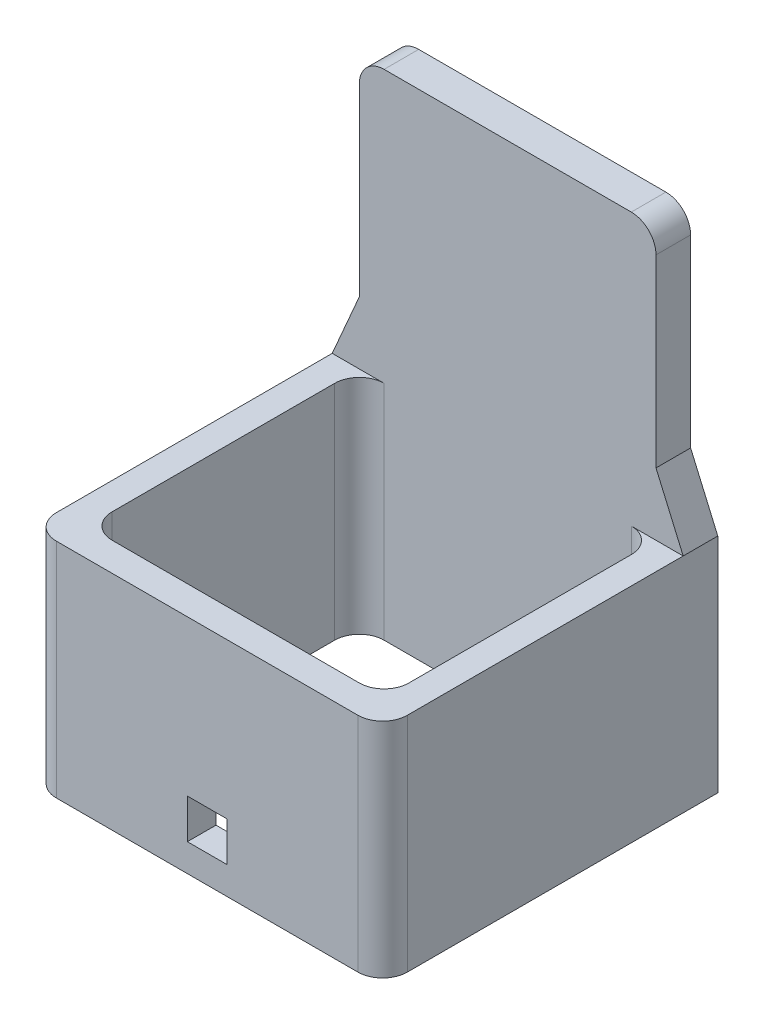
ISO-10303-21;
HEADER;
FILE_DESCRIPTION(('STEP AP214'),'2;1');
FILE_NAME('part.step','',(''),(''),'','','');
FILE_SCHEMA(('AUTOMOTIVE_DESIGN { 1 0 10303 214 1 1 1 1 }'));
ENDSEC;
DATA;
#1=APPLICATION_CONTEXT('core data for automotive mechanical design processes');
#2=APPLICATION_PROTOCOL_DEFINITION('international standard','automotive_design',2000,#1);
#3=PRODUCT_CONTEXT('',#1,'mechanical');
#4=PRODUCT('Part','Part','',(#3));
#5=PRODUCT_RELATED_PRODUCT_CATEGORY('part','',(#4));
#6=PRODUCT_DEFINITION_FORMATION('','',#4);
#7=PRODUCT_DEFINITION_CONTEXT('part definition',#1,'design');
#8=PRODUCT_DEFINITION('design','',#6,#7);
#9=PRODUCT_DEFINITION_SHAPE('','',#8);
#10=(LENGTH_UNIT() NAMED_UNIT(*) SI_UNIT(.MILLI.,.METRE.));
#11=(NAMED_UNIT(*) PLANE_ANGLE_UNIT() SI_UNIT($,.RADIAN.));
#12=(NAMED_UNIT(*) SI_UNIT($,.STERADIAN.) SOLID_ANGLE_UNIT());
#13=UNCERTAINTY_MEASURE_WITH_UNIT(LENGTH_MEASURE(1.E-05),#10,'distance_accuracy_value','');
#14=(GEOMETRIC_REPRESENTATION_CONTEXT(3) GLOBAL_UNCERTAINTY_ASSIGNED_CONTEXT((#13)) GLOBAL_UNIT_ASSIGNED_CONTEXT((#10,
#11,#12)) REPRESENTATION_CONTEXT('',''));
#15=CARTESIAN_POINT('',(0.,0.,0.));
#16=DIRECTION('',(0.,0.,1.));
#17=DIRECTION('',(1.,0.,0.));
#18=AXIS2_PLACEMENT_3D('',#15,#16,#17);
#19=CARTESIAN_POINT('',(5.,-5.,7.));
#20=DIRECTION('',(0.,0.,-1.));
#21=DIRECTION('',(-1.,0.,0.));
#22=AXIS2_PLACEMENT_3D('',#19,#20,#21);
#23=CYLINDRICAL_SURFACE('',#22,5.);
#24=CARTESIAN_POINT('',(5.,-5.,7.));
#25=DIRECTION('',(0.,0.,1.));
#26=DIRECTION('',(-1.,0.,0.));
#27=AXIS2_PLACEMENT_3D('',#24,#25,#26);
#28=CIRCLE('',#27,5.);
#29=CARTESIAN_POINT('',(5.,0.,7.));
#30=VERTEX_POINT('',#29);
#31=CARTESIAN_POINT('',(0.,-5.,7.));
#32=VERTEX_POINT('',#31);
#33=EDGE_CURVE('E340',#30,#32,#28,.T.);
#34=ORIENTED_EDGE('',*,*,#33,.F.);
#35=DIRECTION('',(0.,0.,1.));
#36=VECTOR('',#35,1.);
#37=CARTESIAN_POINT('',(5.,0.,7.));
#38=LINE('',#37,#36);
#39=CARTESIAN_POINT('',(5.,0.,0.));
#40=VERTEX_POINT('',#39);
#41=EDGE_CURVE('E341',#40,#30,#38,.T.);
#42=ORIENTED_EDGE('',*,*,#41,.F.);
#43=CARTESIAN_POINT('',(5.,-5.,0.));
#44=DIRECTION('',(0.,0.,-1.));
#45=DIRECTION('',(-1.,0.,0.));
#46=AXIS2_PLACEMENT_3D('',#43,#44,#45);
#47=CIRCLE('',#46,5.);
#48=CARTESIAN_POINT('',(0.,-5.,0.));
#49=VERTEX_POINT('',#48);
#50=EDGE_CURVE('E324',#49,#40,#47,.T.);
#51=ORIENTED_EDGE('',*,*,#50,.F.);
#52=DIRECTION('',(0.,0.,-1.));
#53=VECTOR('',#52,1.);
#54=CARTESIAN_POINT('',(0.,-5.,7.));
#55=LINE('',#54,#53);
#56=EDGE_CURVE('E440',#32,#49,#55,.T.);
#57=ORIENTED_EDGE('',*,*,#56,.F.);
#58=EDGE_LOOP('',(#34,#42,#51,#57));
#59=FACE_BOUND('',#58,.T.);
#60=ADVANCED_FACE('F15',(#59),#23,.T.);
#61=CARTESIAN_POINT('',(55.,-5.,7.));
#62=DIRECTION('',(0.,0.,-1.));
#63=DIRECTION('',(-1.,0.,0.));
#64=AXIS2_PLACEMENT_3D('',#61,#62,#63);
#65=CYLINDRICAL_SURFACE('',#64,5.);
#66=CARTESIAN_POINT('',(55.,-5.,7.));
#67=DIRECTION('',(0.,0.,1.));
#68=DIRECTION('',(-1.,0.,0.));
#69=AXIS2_PLACEMENT_3D('',#66,#67,#68);
#70=CIRCLE('',#69,5.);
#71=CARTESIAN_POINT('',(60.,-5.,7.));
#72=VERTEX_POINT('',#71);
#73=CARTESIAN_POINT('',(55.,0.,7.));
#74=VERTEX_POINT('',#73);
#75=EDGE_CURVE('E337',#72,#74,#70,.T.);
#76=ORIENTED_EDGE('',*,*,#75,.F.);
#77=DIRECTION('',(0.,0.,1.));
#78=VECTOR('',#77,1.);
#79=CARTESIAN_POINT('',(60.,-5.,7.));
#80=LINE('',#79,#78);
#81=CARTESIAN_POINT('',(60.,-5.,0.));
#82=VERTEX_POINT('',#81);
#83=EDGE_CURVE('E372',#82,#72,#80,.T.);
#84=ORIENTED_EDGE('',*,*,#83,.F.);
#85=CARTESIAN_POINT('',(55.,-5.,0.));
#86=DIRECTION('',(0.,0.,-1.));
#87=DIRECTION('',(-1.,0.,0.));
#88=AXIS2_PLACEMENT_3D('',#85,#86,#87);
#89=CIRCLE('',#88,5.);
#90=CARTESIAN_POINT('',(55.,0.,0.));
#91=VERTEX_POINT('',#90);
#92=EDGE_CURVE('E350',#91,#82,#89,.T.);
#93=ORIENTED_EDGE('',*,*,#92,.F.);
#94=DIRECTION('',(0.,0.,-1.));
#95=VECTOR('',#94,1.);
#96=CARTESIAN_POINT('',(55.,0.,7.));
#97=LINE('',#96,#95);
#98=EDGE_CURVE('E391',#74,#91,#97,.T.);
#99=ORIENTED_EDGE('',*,*,#98,.F.);
#100=EDGE_LOOP('',(#76,#84,#93,#99));
#101=FACE_BOUND('',#100,.T.);
#102=ADVANCED_FACE('F682',(#101),#65,.T.);
#103=CARTESIAN_POINT('',(60.4957416500345,0.,62.792968406215));
#104=DIRECTION('',(0.,-1.,0.));
#105=DIRECTION('',(0.,0.,-1.));
#106=AXIS2_PLACEMENT_3D('',#103,#104,#105);
#107=CYLINDRICAL_SURFACE('',#106,5.);
#108=CARTESIAN_POINT('',(60.4957416500345,-100.,62.792968406215));
#109=DIRECTION('',(0.,-1.,0.));
#110=DIRECTION('',(0.,0.,1.));
#111=AXIS2_PLACEMENT_3D('',#108,#109,#110);
#112=CIRCLE('',#111,5.);
#113=CARTESIAN_POINT('',(65.4957416500345,-100.,62.792968406215));
#114=VERTEX_POINT('',#113);
#115=CARTESIAN_POINT('',(60.4957416500345,-100.,67.792968406215));
#116=VERTEX_POINT('',#115);
#117=EDGE_CURVE('E241',#114,#116,#112,.T.);
#118=ORIENTED_EDGE('',*,*,#117,.F.);
#119=DIRECTION('',(0.,-1.,0.));
#120=VECTOR('',#119,1.);
#121=CARTESIAN_POINT('',(65.4957416500345,-100.,62.792968406215));
#122=LINE('',#121,#120);
#123=CARTESIAN_POINT('',(65.4957416500345,-55.,62.792968406215));
#124=VERTEX_POINT('',#123);
#125=EDGE_CURVE('E234',#124,#114,#122,.T.);
#126=ORIENTED_EDGE('',*,*,#125,.F.);
#127=CARTESIAN_POINT('',(60.4957416500345,-55.,62.792968406215));
#128=DIRECTION('',(0.,1.,0.));
#129=DIRECTION('',(0.,0.,1.));
#130=AXIS2_PLACEMENT_3D('',#127,#128,#129);
#131=CIRCLE('',#130,5.);
#132=CARTESIAN_POINT('',(60.4957416500345,-55.,67.792968406215));
#133=VERTEX_POINT('',#132);
#134=EDGE_CURVE('E238',#133,#124,#131,.T.);
#135=ORIENTED_EDGE('',*,*,#134,.F.);
#136=DIRECTION('',(0.,1.,0.));
#137=VECTOR('',#136,1.);
#138=CARTESIAN_POINT('',(60.4957416500345,-55.,67.792968406215));
#139=LINE('',#138,#137);
#140=EDGE_CURVE('E363',#116,#133,#139,.T.);
#141=ORIENTED_EDGE('',*,*,#140,.F.);
#142=EDGE_LOOP('',(#118,#126,#135,#141));
#143=FACE_BOUND('',#142,.T.);
#144=ADVANCED_FACE('F236',(#143),#107,.T.);
#145=CARTESIAN_POINT('',(-0.495741650034525,0.,62.792968406215));
#146=DIRECTION('',(0.,1.,0.));
#147=DIRECTION('',(0.,0.,1.));
#148=AXIS2_PLACEMENT_3D('',#145,#146,#147);
#149=CYLINDRICAL_SURFACE('',#148,5.);
#150=CARTESIAN_POINT('',(-0.495741650034525,-55.,62.792968406215));
#151=DIRECTION('',(0.,1.,0.));
#152=DIRECTION('',(0.,0.,1.));
#153=AXIS2_PLACEMENT_3D('',#150,#151,#152);
#154=CIRCLE('',#153,5.);
#155=CARTESIAN_POINT('',(-5.49574165003453,-55.,62.792968406215));
#156=VERTEX_POINT('',#155);
#157=CARTESIAN_POINT('',(-0.495741650034527,-55.,67.792968406215));
#158=VERTEX_POINT('',#157);
#159=EDGE_CURVE('E270',#156,#158,#154,.T.);
#160=ORIENTED_EDGE('',*,*,#159,.F.);
#161=DIRECTION('',(0.,1.,0.));
#162=VECTOR('',#161,1.);
#163=CARTESIAN_POINT('',(-5.49574165003453,-55.,62.792968406215));
#164=LINE('',#163,#162);
#165=CARTESIAN_POINT('',(-5.49574165003453,-100.,62.792968406215));
#166=VERTEX_POINT('',#165);
#167=EDGE_CURVE('E285',#166,#156,#164,.T.);
#168=ORIENTED_EDGE('',*,*,#167,.F.);
#169=CARTESIAN_POINT('',(-0.495741650034525,-100.,62.792968406215));
#170=DIRECTION('',(0.,-1.,0.));
#171=DIRECTION('',(0.,0.,1.));
#172=AXIS2_PLACEMENT_3D('',#169,#170,#171);
#173=CIRCLE('',#172,5.);
#174=CARTESIAN_POINT('',(-0.49574165003452,-100.,67.792968406215));
#175=VERTEX_POINT('',#174);
#176=EDGE_CURVE('E419',#175,#166,#173,.T.);
#177=ORIENTED_EDGE('',*,*,#176,.F.);
#178=DIRECTION('',(0.,-1.,0.));
#179=VECTOR('',#178,1.);
#180=CARTESIAN_POINT('',(-0.495741650034525,-100.,67.792968406215));
#181=LINE('',#180,#179);
#182=EDGE_CURVE('E366',#158,#175,#181,.T.);
#183=ORIENTED_EDGE('',*,*,#182,.F.);
#184=EDGE_LOOP('',(#160,#168,#177,#183));
#185=FACE_BOUND('',#184,.T.);
#186=ADVANCED_FACE('F782',(#185),#149,.T.);
#187=CARTESIAN_POINT('',(26.,-86.3993665561437,49.792968406215));
#188=DIRECTION('',(0.,1.,0.));
#189=DIRECTION('',(1.,0.,0.));
#190=AXIS2_PLACEMENT_3D('',#187,#188,#189);
#191=PLANE('',#190);
#192=DIRECTION('',(1.,0.,0.));
#193=VECTOR('',#192,1.);
#194=CARTESIAN_POINT('',(60.,-86.3993665561437,62.));
#195=LINE('',#194,#193);
#196=CARTESIAN_POINT('',(26.,-86.3993665561437,62.));
#197=VERTEX_POINT('',#196);
#198=CARTESIAN_POINT('',(34.,-86.3993665561437,62.));
#199=VERTEX_POINT('',#198);
#200=EDGE_CURVE('E356',#197,#199,#195,.T.);
#201=ORIENTED_EDGE('',*,*,#200,.T.);
#202=DIRECTION('',(0.,0.,1.));
#203=VECTOR('',#202,1.);
#204=CARTESIAN_POINT('',(34.,-86.3993665561437,49.792968406215));
#205=LINE('',#204,#203);
#206=CARTESIAN_POINT('',(34.,-86.3993665561437,67.792968406215));
#207=VERTEX_POINT('',#206);
#208=EDGE_CURVE('E312',#199,#207,#205,.T.);
#209=ORIENTED_EDGE('',*,*,#208,.T.);
#210=DIRECTION('',(-1.,0.,0.));
#211=VECTOR('',#210,1.);
#212=CARTESIAN_POINT('',(26.,-86.3993665561437,67.792968406215));
#213=LINE('',#212,#211);
#214=CARTESIAN_POINT('',(26.,-86.3993665561437,67.792968406215));
#215=VERTEX_POINT('',#214);
#216=EDGE_CURVE('E358',#207,#215,#213,.T.);
#217=ORIENTED_EDGE('',*,*,#216,.T.);
#218=DIRECTION('',(0.,0.,1.));
#219=VECTOR('',#218,1.);
#220=CARTESIAN_POINT('',(26.,-86.3993665561437,49.792968406215));
#221=LINE('',#220,#219);
#222=EDGE_CURVE('E10',#197,#215,#221,.T.);
#223=ORIENTED_EDGE('',*,*,#222,.F.);
#224=EDGE_LOOP('',(#201,#209,#217,#223));
#225=FACE_BOUND('',#224,.T.);
#226=ADVANCED_FACE('F787',(#225),#191,.F.);
#227=CARTESIAN_POINT('',(26.,-86.3993665561437,49.792968406215));
#228=DIRECTION('',(-1.,0.,0.));
#229=DIRECTION('',(0.,0.,1.));
#230=AXIS2_PLACEMENT_3D('',#227,#228,#229);
#231=PLANE('',#230);
#232=DIRECTION('',(0.,1.,0.));
#233=VECTOR('',#232,1.);
#234=CARTESIAN_POINT('',(26.,-55.,62.));
#235=LINE('',#234,#233);
#236=CARTESIAN_POINT('',(26.,-94.3993665561437,62.));
#237=VERTEX_POINT('',#236);
#238=EDGE_CURVE('E410',#237,#197,#235,.T.);
#239=ORIENTED_EDGE('',*,*,#238,.T.);
#240=ORIENTED_EDGE('',*,*,#222,.T.);
#241=DIRECTION('',(0.,-1.,0.));
#242=VECTOR('',#241,1.);
#243=CARTESIAN_POINT('',(26.,-86.3993665561437,67.792968406215));
#244=LINE('',#243,#242);
#245=CARTESIAN_POINT('',(26.,-94.3993665561437,67.792968406215));
#246=VERTEX_POINT('',#245);
#247=EDGE_CURVE('E247',#215,#246,#244,.T.);
#248=ORIENTED_EDGE('',*,*,#247,.T.);
#249=DIRECTION('',(0.,0.,1.));
#250=VECTOR('',#249,1.);
#251=CARTESIAN_POINT('',(26.,-94.3993665561437,49.792968406215));
#252=LINE('',#251,#250);
#253=EDGE_CURVE('E19',#237,#246,#252,.T.);
#254=ORIENTED_EDGE('',*,*,#253,.F.);
#255=EDGE_LOOP('',(#239,#240,#248,#254));
#256=FACE_BOUND('',#255,.T.);
#257=ADVANCED_FACE('F815',(#256),#231,.F.);
#258=CARTESIAN_POINT('',(26.,-94.3993665561437,49.792968406215));
#259=DIRECTION('',(0.,-1.,0.));
#260=DIRECTION('',(0.,0.,-1.));
#261=AXIS2_PLACEMENT_3D('',#258,#259,#260);
#262=PLANE('',#261);
#263=DIRECTION('',(-1.,0.,0.));
#264=VECTOR('',#263,1.);
#265=CARTESIAN_POINT('',(60.,-94.3993665561437,62.));
#266=LINE('',#265,#264);
#267=CARTESIAN_POINT('',(34.,-94.3993665561437,62.));
#268=VERTEX_POINT('',#267);
#269=EDGE_CURVE('E319',#268,#237,#266,.T.);
#270=ORIENTED_EDGE('',*,*,#269,.T.);
#271=ORIENTED_EDGE('',*,*,#253,.T.);
#272=DIRECTION('',(1.,0.,0.));
#273=VECTOR('',#272,1.);
#274=CARTESIAN_POINT('',(26.,-94.3993665561437,67.792968406215));
#275=LINE('',#274,#273);
#276=CARTESIAN_POINT('',(34.,-94.3993665561437,67.792968406215));
#277=VERTEX_POINT('',#276);
#278=EDGE_CURVE('E346',#246,#277,#275,.T.);
#279=ORIENTED_EDGE('',*,*,#278,.T.);
#280=DIRECTION('',(0.,0.,1.));
#281=VECTOR('',#280,1.);
#282=CARTESIAN_POINT('',(34.,-94.3993665561437,49.792968406215));
#283=LINE('',#282,#281);
#284=EDGE_CURVE('E284',#268,#277,#283,.T.);
#285=ORIENTED_EDGE('',*,*,#284,.F.);
#286=EDGE_LOOP('',(#270,#271,#279,#285));
#287=FACE_BOUND('',#286,.T.);
#288=ADVANCED_FACE('F668',(#287),#262,.F.);
#289=CARTESIAN_POINT('',(34.,-86.3993665561437,49.792968406215));
#290=DIRECTION('',(1.,0.,0.));
#291=DIRECTION('',(0.,1.,0.));
#292=AXIS2_PLACEMENT_3D('',#289,#290,#291);
#293=PLANE('',#292);
#294=DIRECTION('',(0.,-1.,0.));
#295=VECTOR('',#294,1.);
#296=CARTESIAN_POINT('',(34.,-55.,62.));
#297=LINE('',#296,#295);
#298=EDGE_CURVE('E352',#199,#268,#297,.T.);
#299=ORIENTED_EDGE('',*,*,#298,.T.);
#300=ORIENTED_EDGE('',*,*,#284,.T.);
#301=DIRECTION('',(0.,1.,0.));
#302=VECTOR('',#301,1.);
#303=CARTESIAN_POINT('',(34.,-86.3993665561437,67.792968406215));
#304=LINE('',#303,#302);
#305=EDGE_CURVE('E362',#277,#207,#304,.T.);
#306=ORIENTED_EDGE('',*,*,#305,.T.);
#307=ORIENTED_EDGE('',*,*,#208,.F.);
#308=EDGE_LOOP('',(#299,#300,#306,#307));
#309=FACE_BOUND('',#308,.T.);
#310=ADVANCED_FACE('F662',(#309),#293,.F.);
#311=CARTESIAN_POINT('',(-5.49574165003453,-55.,0.));
#312=DIRECTION('',(-0.91750472386796,0.397724881896994,0.));
#313=DIRECTION('',(0.,0.,1.));
#314=AXIS2_PLACEMENT_3D('',#311,#312,#313);
#315=PLANE('',#314);
#316=DIRECTION('',(-0.397724881896994,-0.91750472386796,0.));
#317=VECTOR('',#316,1.);
#318=CARTESIAN_POINT('',(-5.49574165003453,-55.,7.));
#319=LINE('',#318,#317);
#320=CARTESIAN_POINT('',(0.,-42.3219676349782,7.));
#321=VERTEX_POINT('',#320);
#322=CARTESIAN_POINT('',(-5.49574165003453,-55.,7.));
#323=VERTEX_POINT('',#322);
#324=EDGE_CURVE('E443',#321,#323,#319,.T.);
#325=ORIENTED_EDGE('',*,*,#324,.F.);
#326=DIRECTION('',(0.,0.,1.));
#327=VECTOR('',#326,1.);
#328=CARTESIAN_POINT('',(0.,-42.3219676349782,0.));
#329=LINE('',#328,#327);
#330=CARTESIAN_POINT('',(0.,-42.3219676349782,0.));
#331=VERTEX_POINT('',#330);
#332=EDGE_CURVE('E514',#331,#321,#329,.T.);
#333=ORIENTED_EDGE('',*,*,#332,.F.);
#334=DIRECTION('',(-0.397724881896994,-0.91750472386796,0.));
#335=VECTOR('',#334,1.);
#336=CARTESIAN_POINT('',(-5.49574165003453,-55.,0.));
#337=LINE('',#336,#335);
#338=CARTESIAN_POINT('',(-5.49574165003453,-55.,0.));
#339=VERTEX_POINT('',#338);
#340=EDGE_CURVE('E279',#331,#339,#337,.T.);
#341=ORIENTED_EDGE('',*,*,#340,.T.);
#342=DIRECTION('',(0.,0.,1.));
#343=VECTOR('',#342,1.);
#344=CARTESIAN_POINT('',(-5.49574165003453,-55.,-45.3343487466615));
#345=LINE('',#344,#343);
#346=EDGE_CURVE('E281',#339,#323,#345,.T.);
#347=ORIENTED_EDGE('',*,*,#346,.T.);
#348=EDGE_LOOP('',(#325,#333,#341,#347));
#349=FACE_BOUND('',#348,.T.);
#350=ADVANCED_FACE('F667',(#349),#315,.T.);
#351=CARTESIAN_POINT('',(65.4957416500345,-55.,0.));
#352=DIRECTION('',(0.91750472386796,0.397724881896994,0.));
#353=DIRECTION('',(0.,0.,-1.));
#354=AXIS2_PLACEMENT_3D('',#351,#352,#353);
#355=PLANE('',#354);
#356=DIRECTION('',(-0.397724881896994,0.91750472386796,0.));
#357=VECTOR('',#356,1.);
#358=CARTESIAN_POINT('',(65.4957416500345,-55.,7.));
#359=LINE('',#358,#357);
#360=CARTESIAN_POINT('',(65.4957416500345,-55.,7.));
#361=VERTEX_POINT('',#360);
#362=CARTESIAN_POINT('',(60.,-42.3219676349782,7.));
#363=VERTEX_POINT('',#362);
#364=EDGE_CURVE('E347',#361,#363,#359,.T.);
#365=ORIENTED_EDGE('',*,*,#364,.F.);
#366=DIRECTION('',(0.,0.,1.));
#367=VECTOR('',#366,1.);
#368=CARTESIAN_POINT('',(65.4957416500345,-55.,-45.3343487466615));
#369=LINE('',#368,#367);
#370=CARTESIAN_POINT('',(65.4957416500345,-55.,0.));
#371=VERTEX_POINT('',#370);
#372=EDGE_CURVE('E246',#371,#361,#369,.T.);
#373=ORIENTED_EDGE('',*,*,#372,.F.);
#374=DIRECTION('',(-0.397724881896994,0.91750472386796,0.));
#375=VECTOR('',#374,1.);
#376=CARTESIAN_POINT('',(65.4957416500345,-55.,0.));
#377=LINE('',#376,#375);
#378=CARTESIAN_POINT('',(60.,-42.3219676349782,0.));
#379=VERTEX_POINT('',#378);
#380=EDGE_CURVE('E403',#371,#379,#377,.T.);
#381=ORIENTED_EDGE('',*,*,#380,.T.);
#382=DIRECTION('',(0.,0.,1.));
#383=VECTOR('',#382,1.);
#384=CARTESIAN_POINT('',(60.,-42.3219676349782,0.));
#385=LINE('',#384,#383);
#386=EDGE_CURVE('E386',#379,#363,#385,.T.);
#387=ORIENTED_EDGE('',*,*,#386,.T.);
#388=EDGE_LOOP('',(#365,#373,#381,#387));
#389=FACE_BOUND('',#388,.T.);
#390=ADVANCED_FACE('F552',(#389),#355,.T.);
#391=CARTESIAN_POINT('',(5.,-100.,57.));
#392=DIRECTION('',(0.,1.,0.));
#393=DIRECTION('',(0.,0.,1.));
#394=AXIS2_PLACEMENT_3D('',#391,#392,#393);
#395=CYLINDRICAL_SURFACE('',#394,5.);
#396=CARTESIAN_POINT('',(5.,-55.,57.));
#397=DIRECTION('',(0.,-1.,0.));
#398=DIRECTION('',(0.,0.,1.));
#399=AXIS2_PLACEMENT_3D('',#396,#397,#398);
#400=CIRCLE('',#399,5.);
#401=CARTESIAN_POINT('',(5.,-55.,62.));
#402=VERTEX_POINT('',#401);
#403=CARTESIAN_POINT('',(0.,-55.,57.));
#404=VERTEX_POINT('',#403);
#405=EDGE_CURVE('E290',#402,#404,#400,.T.);
#406=ORIENTED_EDGE('',*,*,#405,.F.);
#407=DIRECTION('',(0.,1.,0.));
#408=VECTOR('',#407,1.);
#409=CARTESIAN_POINT('',(5.,-55.,62.));
#410=LINE('',#409,#408);
#411=CARTESIAN_POINT('',(5.,-100.,62.));
#412=VERTEX_POINT('',#411);
#413=EDGE_CURVE('E371',#412,#402,#410,.T.);
#414=ORIENTED_EDGE('',*,*,#413,.F.);
#415=CARTESIAN_POINT('',(5.,-100.,57.));
#416=DIRECTION('',(0.,1.,0.));
#417=DIRECTION('',(0.,0.,1.));
#418=AXIS2_PLACEMENT_3D('',#415,#416,#417);
#419=CIRCLE('',#418,5.);
#420=CARTESIAN_POINT('',(0.,-100.,57.));
#421=VERTEX_POINT('',#420);
#422=EDGE_CURVE('E424',#421,#412,#419,.T.);
#423=ORIENTED_EDGE('',*,*,#422,.F.);
#424=DIRECTION('',(0.,-1.,0.));
#425=VECTOR('',#424,1.);
#426=CARTESIAN_POINT('',(0.,-100.,57.));
#427=LINE('',#426,#425);
#428=EDGE_CURVE('E306',#404,#421,#427,.T.);
#429=ORIENTED_EDGE('',*,*,#428,.F.);
#430=EDGE_LOOP('',(#406,#414,#423,#429));
#431=FACE_BOUND('',#430,.T.);
#432=ADVANCED_FACE('F706',(#431),#395,.F.);
#433=CARTESIAN_POINT('',(5.,0.,12.));
#434=DIRECTION('',(0.,-1.,0.));
#435=DIRECTION('',(0.,0.,-1.));
#436=AXIS2_PLACEMENT_3D('',#433,#434,#435);
#437=CYLINDRICAL_SURFACE('',#436,5.);
#438=CARTESIAN_POINT('',(5.,-55.,12.));
#439=DIRECTION('',(0.,-1.,0.));
#440=DIRECTION('',(0.,0.,1.));
#441=AXIS2_PLACEMENT_3D('',#438,#439,#440);
#442=CIRCLE('',#441,5.);
#443=CARTESIAN_POINT('',(0.,-55.,12.));
#444=VERTEX_POINT('',#443);
#445=CARTESIAN_POINT('',(5.,-55.,7.));
#446=VERTEX_POINT('',#445);
#447=EDGE_CURVE('E292',#444,#446,#442,.T.);
#448=ORIENTED_EDGE('',*,*,#447,.F.);
#449=DIRECTION('',(0.,1.,0.));
#450=VECTOR('',#449,1.);
#451=CARTESIAN_POINT('',(0.,-100.,12.));
#452=LINE('',#451,#450);
#453=CARTESIAN_POINT('',(0.,-100.,12.));
#454=VERTEX_POINT('',#453);
#455=EDGE_CURVE('E308',#454,#444,#452,.T.);
#456=ORIENTED_EDGE('',*,*,#455,.F.);
#457=CARTESIAN_POINT('',(5.,-100.,12.));
#458=DIRECTION('',(0.,1.,0.));
#459=DIRECTION('',(0.,0.,1.));
#460=AXIS2_PLACEMENT_3D('',#457,#458,#459);
#461=CIRCLE('',#460,5.);
#462=CARTESIAN_POINT('',(5.,-100.,7.));
#463=VERTEX_POINT('',#462);
#464=EDGE_CURVE('E332',#463,#454,#461,.T.);
#465=ORIENTED_EDGE('',*,*,#464,.F.);
#466=DIRECTION('',(0.,-1.,0.));
#467=VECTOR('',#466,1.);
#468=CARTESIAN_POINT('',(5.,0.,7.));
#469=LINE('',#468,#467);
#470=EDGE_CURVE('E444',#446,#463,#469,.T.);
#471=ORIENTED_EDGE('',*,*,#470,.F.);
#472=EDGE_LOOP('',(#448,#456,#465,#471));
#473=FACE_BOUND('',#472,.T.);
#474=ADVANCED_FACE('F740',(#473),#437,.F.);
#475=CARTESIAN_POINT('',(55.,0.,12.));
#476=DIRECTION('',(0.,1.,0.));
#477=DIRECTION('',(0.,0.,1.));
#478=AXIS2_PLACEMENT_3D('',#475,#476,#477);
#479=CYLINDRICAL_SURFACE('',#478,5.);
#480=CARTESIAN_POINT('',(55.,-100.,12.));
#481=DIRECTION('',(0.,1.,0.));
#482=DIRECTION('',(0.,0.,1.));
#483=AXIS2_PLACEMENT_3D('',#480,#481,#482);
#484=CIRCLE('',#483,5.);
#485=CARTESIAN_POINT('',(60.,-100.,12.));
#486=VERTEX_POINT('',#485);
#487=CARTESIAN_POINT('',(55.,-100.,7.));
#488=VERTEX_POINT('',#487);
#489=EDGE_CURVE('E400',#486,#488,#484,.T.);
#490=ORIENTED_EDGE('',*,*,#489,.F.);
#491=DIRECTION('',(0.,-1.,0.));
#492=VECTOR('',#491,1.);
#493=CARTESIAN_POINT('',(60.,-100.,12.));
#494=LINE('',#493,#492);
#495=CARTESIAN_POINT('',(60.,-55.,12.));
#496=VERTEX_POINT('',#495);
#497=EDGE_CURVE('E320',#496,#486,#494,.T.);
#498=ORIENTED_EDGE('',*,*,#497,.F.);
#499=CARTESIAN_POINT('',(55.,-55.,12.));
#500=DIRECTION('',(0.,-1.,0.));
#501=DIRECTION('',(0.,0.,1.));
#502=AXIS2_PLACEMENT_3D('',#499,#500,#501);
#503=CIRCLE('',#502,5.);
#504=CARTESIAN_POINT('',(55.,-55.,7.));
#505=VERTEX_POINT('',#504);
#506=EDGE_CURVE('E336',#505,#496,#503,.T.);
#507=ORIENTED_EDGE('',*,*,#506,.F.);
#508=DIRECTION('',(0.,1.,0.));
#509=VECTOR('',#508,1.);
#510=CARTESIAN_POINT('',(55.,0.,7.));
#511=LINE('',#510,#509);
#512=EDGE_CURVE('E351',#488,#505,#511,.T.);
#513=ORIENTED_EDGE('',*,*,#512,.F.);
#514=EDGE_LOOP('',(#490,#498,#507,#513));
#515=FACE_BOUND('',#514,.T.);
#516=ADVANCED_FACE('F482',(#515),#479,.F.);
#517=CARTESIAN_POINT('',(55.,-55.,57.));
#518=DIRECTION('',(0.,1.,0.));
#519=DIRECTION('',(0.,0.,1.));
#520=AXIS2_PLACEMENT_3D('',#517,#518,#519);
#521=CYLINDRICAL_SURFACE('',#520,5.);
#522=CARTESIAN_POINT('',(55.,-55.,57.));
#523=DIRECTION('',(0.,-1.,0.));
#524=DIRECTION('',(0.,0.,1.));
#525=AXIS2_PLACEMENT_3D('',#522,#523,#524);
#526=CIRCLE('',#525,5.);
#527=CARTESIAN_POINT('',(60.,-55.,57.));
#528=VERTEX_POINT('',#527);
#529=CARTESIAN_POINT('',(55.,-55.,62.));
#530=VERTEX_POINT('',#529);
#531=EDGE_CURVE('E291',#528,#530,#526,.T.);
#532=ORIENTED_EDGE('',*,*,#531,.F.);
#533=DIRECTION('',(0.,1.,0.));
#534=VECTOR('',#533,1.);
#535=CARTESIAN_POINT('',(60.,-55.,57.));
#536=LINE('',#535,#534);
#537=CARTESIAN_POINT('',(60.,-100.,57.));
#538=VERTEX_POINT('',#537);
#539=EDGE_CURVE('E323',#538,#528,#536,.T.);
#540=ORIENTED_EDGE('',*,*,#539,.F.);
#541=CARTESIAN_POINT('',(55.,-100.,57.));
#542=DIRECTION('',(0.,1.,0.));
#543=DIRECTION('',(0.,0.,1.));
#544=AXIS2_PLACEMENT_3D('',#541,#542,#543);
#545=CIRCLE('',#544,5.);
#546=CARTESIAN_POINT('',(55.,-100.,62.));
#547=VERTEX_POINT('',#546);
#548=EDGE_CURVE('E428',#547,#538,#545,.T.);
#549=ORIENTED_EDGE('',*,*,#548,.F.);
#550=DIRECTION('',(0.,-1.,0.));
#551=VECTOR('',#550,1.);
#552=CARTESIAN_POINT('',(55.,-100.,62.));
#553=LINE('',#552,#551);
#554=EDGE_CURVE('E357',#530,#547,#553,.T.);
#555=ORIENTED_EDGE('',*,*,#554,.F.);
#556=EDGE_LOOP('',(#532,#540,#549,#555));
#557=FACE_BOUND('',#556,.T.);
#558=ADVANCED_FACE('F492',(#557),#521,.F.);
#559=CARTESIAN_POINT('',(-5.49574165003453,-55.,-45.3343487466615));
#560=DIRECTION('',(-1.,0.,0.));
#561=DIRECTION('',(0.,0.,1.));
#562=AXIS2_PLACEMENT_3D('',#559,#560,#561);
#563=PLANE('',#562);
#564=DIRECTION('',(0.,0.,1.));
#565=VECTOR('',#564,1.);
#566=CARTESIAN_POINT('',(-5.49574165003453,-100.,-45.3343487466615));
#567=LINE('',#566,#565);
#568=CARTESIAN_POINT('',(-5.49574165003453,-100.,0.));
#569=VERTEX_POINT('',#568);
#570=EDGE_CURVE('E303',#569,#166,#567,.T.);
#571=ORIENTED_EDGE('',*,*,#570,.T.);
#572=ORIENTED_EDGE('',*,*,#167,.T.);
#573=DIRECTION('',(0.,0.,1.));
#574=VECTOR('',#573,1.);
#575=CARTESIAN_POINT('',(-5.49574165003453,-55.,-45.3343487466615));
#576=LINE('',#575,#574);
#577=EDGE_CURVE('E327',#323,#156,#576,.T.);
#578=ORIENTED_EDGE('',*,*,#577,.F.);
#579=ORIENTED_EDGE('',*,*,#346,.F.);
#580=DIRECTION('',(0.,-1.,0.));
#581=VECTOR('',#580,1.);
#582=CARTESIAN_POINT('',(-5.49574165003453,-55.,0.));
#583=LINE('',#582,#581);
#584=EDGE_CURVE('E276',#339,#569,#583,.T.);
#585=ORIENTED_EDGE('',*,*,#584,.T.);
#586=EDGE_LOOP('',(#571,#572,#578,#579,#585));
#587=FACE_BOUND('',#586,.T.);
#588=ADVANCED_FACE('F714',(#587),#563,.T.);
#589=CARTESIAN_POINT('',(0.,-100.,-45.3343487466615));
#590=DIRECTION('',(1.,0.,0.));
#591=DIRECTION('',(0.,1.,0.));
#592=AXIS2_PLACEMENT_3D('',#589,#590,#591);
#593=PLANE('',#592);
#594=DIRECTION('',(0.,0.,1.));
#595=VECTOR('',#594,1.);
#596=CARTESIAN_POINT('',(0.,-100.,-45.3343487466615));
#597=LINE('',#596,#595);
#598=EDGE_CURVE('E420',#454,#421,#597,.T.);
#599=ORIENTED_EDGE('',*,*,#598,.F.);
#600=ORIENTED_EDGE('',*,*,#455,.T.);
#601=DIRECTION('',(0.,0.,1.));
#602=VECTOR('',#601,1.);
#603=CARTESIAN_POINT('',(0.,-55.,-45.3343487466615));
#604=LINE('',#603,#602);
#605=EDGE_CURVE('E297',#444,#404,#604,.T.);
#606=ORIENTED_EDGE('',*,*,#605,.T.);
#607=ORIENTED_EDGE('',*,*,#428,.T.);
#608=EDGE_LOOP('',(#599,#600,#606,#607));
#609=FACE_BOUND('',#608,.T.);
#610=ADVANCED_FACE('F653',(#609),#593,.T.);
#611=CARTESIAN_POINT('',(60.,-55.,62.));
#612=DIRECTION('',(0.,0.,-1.));
#613=DIRECTION('',(0.,-1.,0.));
#614=AXIS2_PLACEMENT_3D('',#611,#612,#613);
#615=PLANE('',#614);
#616=ORIENTED_EDGE('',*,*,#298,.F.);
#617=ORIENTED_EDGE('',*,*,#200,.F.);
#618=ORIENTED_EDGE('',*,*,#238,.F.);
#619=ORIENTED_EDGE('',*,*,#269,.F.);
#620=EDGE_LOOP('',(#616,#617,#618,#619));
#621=FACE_BOUND('',#620,.T.);
#622=DIRECTION('',(1.,0.,0.));
#623=VECTOR('',#622,1.);
#624=CARTESIAN_POINT('',(60.,-100.,62.));
#625=LINE('',#624,#623);
#626=EDGE_CURVE('E433',#412,#547,#625,.T.);
#627=ORIENTED_EDGE('',*,*,#626,.F.);
#628=ORIENTED_EDGE('',*,*,#413,.T.);
#629=DIRECTION('',(1.,0.,0.));
#630=VECTOR('',#629,1.);
#631=CARTESIAN_POINT('',(60.,-55.,62.));
#632=LINE('',#631,#630);
#633=EDGE_CURVE('E286',#402,#530,#632,.T.);
#634=ORIENTED_EDGE('',*,*,#633,.T.);
#635=ORIENTED_EDGE('',*,*,#554,.T.);
#636=EDGE_LOOP('',(#627,#628,#634,#635));
#637=FACE_BOUND('',#636,.T.);
#638=ADVANCED_FACE('F496',(#621,#637),#615,.T.);
#639=CARTESIAN_POINT('',(65.4957416500345,-55.,-45.3343487466615));
#640=DIRECTION('',(1.,0.,0.));
#641=DIRECTION('',(0.,1.,0.));
#642=AXIS2_PLACEMENT_3D('',#639,#640,#641);
#643=PLANE('',#642);
#644=DIRECTION('',(0.,0.,1.));
#645=VECTOR('',#644,1.);
#646=CARTESIAN_POINT('',(65.4957416500345,-55.,-45.3343487466615));
#647=LINE('',#646,#645);
#648=EDGE_CURVE('E250',#361,#124,#647,.T.);
#649=ORIENTED_EDGE('',*,*,#648,.T.);
#650=ORIENTED_EDGE('',*,*,#125,.T.);
#651=DIRECTION('',(0.,0.,1.));
#652=VECTOR('',#651,1.);
#653=CARTESIAN_POINT('',(65.4957416500345,-100.,-45.3343487466615));
#654=LINE('',#653,#652);
#655=CARTESIAN_POINT('',(65.4957416500345,-100.,0.));
#656=VERTEX_POINT('',#655);
#657=EDGE_CURVE('E302',#656,#114,#654,.T.);
#658=ORIENTED_EDGE('',*,*,#657,.F.);
#659=DIRECTION('',(0.,1.,0.));
#660=VECTOR('',#659,1.);
#661=CARTESIAN_POINT('',(65.4957416500345,-55.,0.));
#662=LINE('',#661,#660);
#663=EDGE_CURVE('E280',#656,#371,#662,.T.);
#664=ORIENTED_EDGE('',*,*,#663,.T.);
#665=ORIENTED_EDGE('',*,*,#372,.T.);
#666=EDGE_LOOP('',(#649,#650,#658,#664,#665));
#667=FACE_BOUND('',#666,.T.);
#668=ADVANCED_FACE('F251',(#667),#643,.T.);
#669=CARTESIAN_POINT('',(0.,0.,67.792968406215));
#670=DIRECTION('',(0.,0.,-1.));
#671=DIRECTION('',(0.,-1.,0.));
#672=AXIS2_PLACEMENT_3D('',#669,#670,#671);
#673=PLANE('',#672);
#674=ORIENTED_EDGE('',*,*,#216,.F.);
#675=ORIENTED_EDGE('',*,*,#305,.F.);
#676=ORIENTED_EDGE('',*,*,#278,.F.);
#677=ORIENTED_EDGE('',*,*,#247,.F.);
#678=EDGE_LOOP('',(#674,#675,#676,#677));
#679=FACE_BOUND('',#678,.T.);
#680=DIRECTION('',(-1.,0.,0.));
#681=VECTOR('',#680,1.);
#682=CARTESIAN_POINT('',(60.,-55.,67.792968406215));
#683=LINE('',#682,#681);
#684=EDGE_CURVE('E263',#133,#158,#683,.T.);
#685=ORIENTED_EDGE('',*,*,#684,.T.);
#686=ORIENTED_EDGE('',*,*,#182,.T.);
#687=DIRECTION('',(1.,0.,0.));
#688=VECTOR('',#687,1.);
#689=CARTESIAN_POINT('',(65.4957416500345,-100.,67.792968406215));
#690=LINE('',#689,#688);
#691=EDGE_CURVE('E450',#175,#116,#690,.T.);
#692=ORIENTED_EDGE('',*,*,#691,.T.);
#693=ORIENTED_EDGE('',*,*,#140,.T.);
#694=EDGE_LOOP('',(#685,#686,#692,#693));
#695=FACE_BOUND('',#694,.T.);
#696=ADVANCED_FACE('F540',(#679,#695),#673,.F.);
#697=CARTESIAN_POINT('',(60.,-100.,-45.3343487466615));
#698=DIRECTION('',(-1.,0.,0.));
#699=DIRECTION('',(0.,0.,1.));
#700=AXIS2_PLACEMENT_3D('',#697,#698,#699);
#701=PLANE('',#700);
#702=DIRECTION('',(0.,0.,1.));
#703=VECTOR('',#702,1.);
#704=CARTESIAN_POINT('',(60.,-55.,-45.3343487466615));
#705=LINE('',#704,#703);
#706=EDGE_CURVE('E316',#496,#528,#705,.T.);
#707=ORIENTED_EDGE('',*,*,#706,.F.);
#708=ORIENTED_EDGE('',*,*,#497,.T.);
#709=DIRECTION('',(0.,0.,1.));
#710=VECTOR('',#709,1.);
#711=CARTESIAN_POINT('',(60.,-100.,-45.3343487466615));
#712=LINE('',#711,#710);
#713=EDGE_CURVE('E432',#486,#538,#712,.T.);
#714=ORIENTED_EDGE('',*,*,#713,.T.);
#715=ORIENTED_EDGE('',*,*,#539,.T.);
#716=EDGE_LOOP('',(#707,#708,#714,#715));
#717=FACE_BOUND('',#716,.T.);
#718=ADVANCED_FACE('F487',(#717),#701,.T.);
#719=CARTESIAN_POINT('',(0.,0.,0.));
#720=DIRECTION('',(0.,0.,-1.));
#721=DIRECTION('',(0.,-1.,0.));
#722=AXIS2_PLACEMENT_3D('',#719,#720,#721);
#723=PLANE('',#722);
#724=DIRECTION('',(-1.,0.,0.));
#725=VECTOR('',#724,1.);
#726=CARTESIAN_POINT('',(0.,0.,0.));
#727=LINE('',#726,#725);
#728=EDGE_CURVE('E395',#91,#40,#727,.T.);
#729=ORIENTED_EDGE('',*,*,#728,.F.);
#730=ORIENTED_EDGE('',*,*,#92,.T.);
#731=DIRECTION('',(0.,1.,0.));
#732=VECTOR('',#731,1.);
#733=CARTESIAN_POINT('',(60.,0.,0.));
#734=LINE('',#733,#732);
#735=EDGE_CURVE('E376',#379,#82,#734,.T.);
#736=ORIENTED_EDGE('',*,*,#735,.F.);
#737=ORIENTED_EDGE('',*,*,#380,.F.);
#738=ORIENTED_EDGE('',*,*,#663,.F.);
#739=DIRECTION('',(1.,0.,0.));
#740=VECTOR('',#739,1.);
#741=CARTESIAN_POINT('',(60.,-100.,0.));
#742=LINE('',#741,#740);
#743=EDGE_CURVE('E298',#569,#656,#742,.T.);
#744=ORIENTED_EDGE('',*,*,#743,.F.);
#745=ORIENTED_EDGE('',*,*,#584,.F.);
#746=ORIENTED_EDGE('',*,*,#340,.F.);
#747=DIRECTION('',(0.,-1.,0.));
#748=VECTOR('',#747,1.);
#749=CARTESIAN_POINT('',(0.,0.,0.));
#750=LINE('',#749,#748);
#751=EDGE_CURVE('E518',#49,#331,#750,.T.);
#752=ORIENTED_EDGE('',*,*,#751,.F.);
#753=ORIENTED_EDGE('',*,*,#50,.T.);
#754=EDGE_LOOP('',(#729,#730,#736,#737,#738,#744,#745,#746,#752,#753));
#755=FACE_BOUND('',#754,.T.);
#756=ADVANCED_FACE('F549',(#755),#723,.T.);
#757=CARTESIAN_POINT('',(0.,0.,7.));
#758=DIRECTION('',(0.,0.,-1.));
#759=DIRECTION('',(0.,-1.,0.));
#760=AXIS2_PLACEMENT_3D('',#757,#758,#759);
#761=PLANE('',#760);
#762=DIRECTION('',(0.,1.,0.));
#763=VECTOR('',#762,1.);
#764=CARTESIAN_POINT('',(60.,0.,7.));
#765=LINE('',#764,#763);
#766=EDGE_CURVE('E274',#363,#72,#765,.T.);
#767=ORIENTED_EDGE('',*,*,#766,.T.);
#768=ORIENTED_EDGE('',*,*,#75,.T.);
#769=DIRECTION('',(-1.,0.,0.));
#770=VECTOR('',#769,1.);
#771=CARTESIAN_POINT('',(0.,0.,7.));
#772=LINE('',#771,#770);
#773=EDGE_CURVE('E396',#74,#30,#772,.T.);
#774=ORIENTED_EDGE('',*,*,#773,.T.);
#775=ORIENTED_EDGE('',*,*,#33,.T.);
#776=DIRECTION('',(0.,-1.,0.));
#777=VECTOR('',#776,1.);
#778=CARTESIAN_POINT('',(0.,0.,7.));
#779=LINE('',#778,#777);
#780=EDGE_CURVE('E390',#32,#321,#779,.T.);
#781=ORIENTED_EDGE('',*,*,#780,.T.);
#782=ORIENTED_EDGE('',*,*,#324,.T.);
#783=DIRECTION('',(1.,0.,0.));
#784=VECTOR('',#783,1.);
#785=CARTESIAN_POINT('',(0.,-55.,7.));
#786=LINE('',#785,#784);
#787=EDGE_CURVE('E296',#323,#446,#786,.T.);
#788=ORIENTED_EDGE('',*,*,#787,.T.);
#789=ORIENTED_EDGE('',*,*,#470,.T.);
#790=DIRECTION('',(1.,0.,0.));
#791=VECTOR('',#790,1.);
#792=CARTESIAN_POINT('',(60.,-100.,7.));
#793=LINE('',#792,#791);
#794=EDGE_CURVE('E328',#463,#488,#793,.T.);
#795=ORIENTED_EDGE('',*,*,#794,.T.);
#796=ORIENTED_EDGE('',*,*,#512,.T.);
#797=DIRECTION('',(1.,0.,0.));
#798=VECTOR('',#797,1.);
#799=CARTESIAN_POINT('',(0.,-55.,7.));
#800=LINE('',#799,#798);
#801=EDGE_CURVE('E257',#505,#361,#800,.T.);
#802=ORIENTED_EDGE('',*,*,#801,.T.);
#803=ORIENTED_EDGE('',*,*,#364,.T.);
#804=EDGE_LOOP('',(#767,#768,#774,#775,#781,#782,#788,#789,#795,#796,#802,#803));
#805=FACE_BOUND('',#804,.T.);
#806=ADVANCED_FACE('F477',(#805),#761,.F.);
#807=CARTESIAN_POINT('',(0.,0.,7.));
#808=DIRECTION('',(0.,-1.,0.));
#809=DIRECTION('',(0.,0.,-1.));
#810=AXIS2_PLACEMENT_3D('',#807,#808,#809);
#811=PLANE('',#810);
#812=ORIENTED_EDGE('',*,*,#773,.F.);
#813=ORIENTED_EDGE('',*,*,#98,.T.);
#814=ORIENTED_EDGE('',*,*,#728,.T.);
#815=ORIENTED_EDGE('',*,*,#41,.T.);
#816=EDGE_LOOP('',(#812,#813,#814,#815));
#817=FACE_BOUND('',#816,.T.);
#818=ADVANCED_FACE('F731',(#817),#811,.F.);
#819=CARTESIAN_POINT('',(60.,-100.,7.));
#820=DIRECTION('',(0.,1.,0.));
#821=DIRECTION('',(1.,0.,0.));
#822=AXIS2_PLACEMENT_3D('',#819,#820,#821);
#823=PLANE('',#822);
#824=ORIENTED_EDGE('',*,*,#794,.F.);
#825=ORIENTED_EDGE('',*,*,#464,.T.);
#826=ORIENTED_EDGE('',*,*,#598,.T.);
#827=ORIENTED_EDGE('',*,*,#422,.T.);
#828=ORIENTED_EDGE('',*,*,#626,.T.);
#829=ORIENTED_EDGE('',*,*,#548,.T.);
#830=ORIENTED_EDGE('',*,*,#713,.F.);
#831=ORIENTED_EDGE('',*,*,#489,.T.);
#832=EDGE_LOOP('',(#824,#825,#826,#827,#828,#829,#830,#831));
#833=FACE_BOUND('',#832,.T.);
#834=ORIENTED_EDGE('',*,*,#691,.F.);
#835=ORIENTED_EDGE('',*,*,#176,.T.);
#836=ORIENTED_EDGE('',*,*,#570,.F.);
#837=ORIENTED_EDGE('',*,*,#743,.T.);
#838=ORIENTED_EDGE('',*,*,#657,.T.);
#839=ORIENTED_EDGE('',*,*,#117,.T.);
#840=EDGE_LOOP('',(#834,#835,#836,#837,#838,#839));
#841=FACE_BOUND('',#840,.T.);
#842=ADVANCED_FACE('F17',(#833,#841),#823,.F.);
#843=CARTESIAN_POINT('',(0.,0.,7.));
#844=DIRECTION('',(1.,0.,0.));
#845=DIRECTION('',(0.,1.,0.));
#846=AXIS2_PLACEMENT_3D('',#843,#844,#845);
#847=PLANE('',#846);
#848=ORIENTED_EDGE('',*,*,#780,.F.);
#849=ORIENTED_EDGE('',*,*,#56,.T.);
#850=ORIENTED_EDGE('',*,*,#751,.T.);
#851=ORIENTED_EDGE('',*,*,#332,.T.);
#852=EDGE_LOOP('',(#848,#849,#850,#851));
#853=FACE_BOUND('',#852,.T.);
#854=ADVANCED_FACE('F837',(#853),#847,.F.);
#855=CARTESIAN_POINT('',(60.,0.,7.));
#856=DIRECTION('',(-1.,0.,0.));
#857=DIRECTION('',(0.,0.,1.));
#858=AXIS2_PLACEMENT_3D('',#855,#856,#857);
#859=PLANE('',#858);
#860=ORIENTED_EDGE('',*,*,#735,.T.);
#861=ORIENTED_EDGE('',*,*,#83,.T.);
#862=ORIENTED_EDGE('',*,*,#766,.F.);
#863=ORIENTED_EDGE('',*,*,#386,.F.);
#864=EDGE_LOOP('',(#860,#861,#862,#863));
#865=FACE_BOUND('',#864,.T.);
#866=ADVANCED_FACE('F555',(#865),#859,.F.);
#867=CARTESIAN_POINT('',(60.,-55.,-45.3343487466615));
#868=DIRECTION('',(0.,1.,0.));
#869=DIRECTION('',(1.,0.,0.));
#870=AXIS2_PLACEMENT_3D('',#867,#868,#869);
#871=PLANE('',#870);
#872=ORIENTED_EDGE('',*,*,#577,.T.);
#873=ORIENTED_EDGE('',*,*,#159,.T.);
#874=ORIENTED_EDGE('',*,*,#684,.F.);
#875=ORIENTED_EDGE('',*,*,#134,.T.);
#876=ORIENTED_EDGE('',*,*,#648,.F.);
#877=ORIENTED_EDGE('',*,*,#801,.F.);
#878=ORIENTED_EDGE('',*,*,#506,.T.);
#879=ORIENTED_EDGE('',*,*,#706,.T.);
#880=ORIENTED_EDGE('',*,*,#531,.T.);
#881=ORIENTED_EDGE('',*,*,#633,.F.);
#882=ORIENTED_EDGE('',*,*,#405,.T.);
#883=ORIENTED_EDGE('',*,*,#605,.F.);
#884=ORIENTED_EDGE('',*,*,#447,.T.);
#885=ORIENTED_EDGE('',*,*,#787,.F.);
#886=EDGE_LOOP('',(#872,#873,#874,#875,#876,#877,#878,#879,#880,#881,#882,#883,#884,#885));
#887=FACE_BOUND('',#886,.T.);
#888=ADVANCED_FACE('F260',(#887),#871,.T.);
#889=CLOSED_SHELL('',(#60,#102,#144,#186,#226,#257,#288,#310,#350,#390,#432,#474,#516,#558,#588,
#610,#638,#668,#696,#718,#756,#806,#818,#842,#854,#866,#888));
#890=MANIFOLD_SOLID_BREP('B1',#889);
#891=ADVANCED_BREP_SHAPE_REPRESENTATION('',(#18,#890),#14);
#892=SHAPE_DEFINITION_REPRESENTATION(#9,#891);
ENDSEC;
END-ISO-10303-21;
